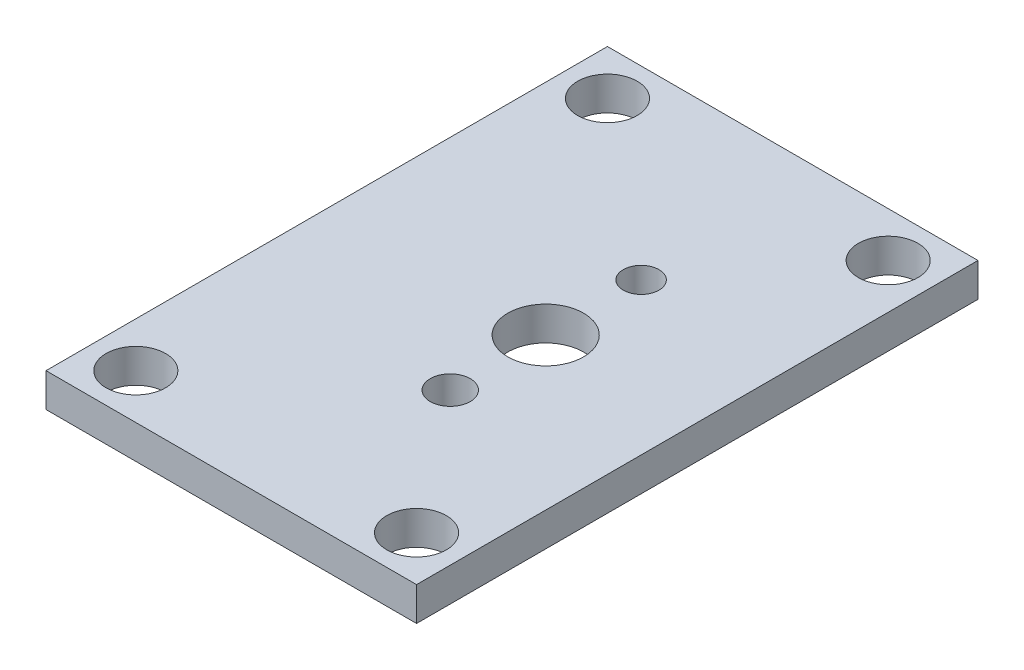
ISO-10303-21;
HEADER;
FILE_DESCRIPTION(('STEP AP214'),'2;1');
FILE_NAME('part.step','',(''),(''),'','','');
FILE_SCHEMA(('AUTOMOTIVE_DESIGN { 1 0 10303 214 1 1 1 1 }'));
ENDSEC;
DATA;
#1=APPLICATION_CONTEXT('core data for automotive mechanical design processes');
#2=APPLICATION_PROTOCOL_DEFINITION('international standard','automotive_design',2000,#1);
#3=PRODUCT_CONTEXT('',#1,'mechanical');
#4=PRODUCT('Part','Part','',(#3));
#5=PRODUCT_RELATED_PRODUCT_CATEGORY('part','',(#4));
#6=PRODUCT_DEFINITION_FORMATION('','',#4);
#7=PRODUCT_DEFINITION_CONTEXT('part definition',#1,'design');
#8=PRODUCT_DEFINITION('design','',#6,#7);
#9=PRODUCT_DEFINITION_SHAPE('','',#8);
#10=(LENGTH_UNIT() NAMED_UNIT(*) SI_UNIT(.MILLI.,.METRE.));
#11=(NAMED_UNIT(*) PLANE_ANGLE_UNIT() SI_UNIT($,.RADIAN.));
#12=(NAMED_UNIT(*) SI_UNIT($,.STERADIAN.) SOLID_ANGLE_UNIT());
#13=UNCERTAINTY_MEASURE_WITH_UNIT(LENGTH_MEASURE(1.E-05),#10,'distance_accuracy_value','');
#14=(GEOMETRIC_REPRESENTATION_CONTEXT(3) GLOBAL_UNCERTAINTY_ASSIGNED_CONTEXT((#13)) GLOBAL_UNIT_ASSIGNED_CONTEXT((#10,
#11,#12)) REPRESENTATION_CONTEXT('',''));
#15=CARTESIAN_POINT('',(0.,0.,0.));
#16=DIRECTION('',(0.,0.,1.));
#17=DIRECTION('',(1.,0.,0.));
#18=AXIS2_PLACEMENT_3D('',#15,#16,#17);
#19=CARTESIAN_POINT('',(0.,0.,0.));
#20=DIRECTION('',(0.,1.,0.));
#21=DIRECTION('',(0.,0.,1.));
#22=AXIS2_PLACEMENT_3D('',#19,#20,#21);
#23=PLANE('',#22);
#24=CARTESIAN_POINT('',(1.27695167286245,0.,-19.8847583643123));
#25=DIRECTION('',(0.,1.,0.));
#26=DIRECTION('',(0.,0.,1.));
#27=AXIS2_PLACEMENT_3D('',#24,#25,#26);
#28=CIRCLE('',#27,1.58978016760219);
#29=CARTESIAN_POINT('',(1.27695167286245,0.,-18.2949781967101));
#30=VERTEX_POINT('',#29);
#31=EDGE_CURVE('E129',#30,#30,#28,.T.);
#32=ORIENTED_EDGE('',*,*,#31,.T.);
#33=EDGE_LOOP('',(#32));
#34=FACE_BOUND('',#33,.T.);
#35=CARTESIAN_POINT('',(1.27695167286245,0.,-2.88475836431227));
#36=DIRECTION('',(0.,1.,0.));
#37=DIRECTION('',(0.,0.,1.));
#38=AXIS2_PLACEMENT_3D('',#35,#36,#37);
#39=CIRCLE('',#38,1.77742826201975);
#40=CARTESIAN_POINT('',(1.27695167286245,0.,-1.10733010229252));
#41=VERTEX_POINT('',#40);
#42=EDGE_CURVE('E127',#41,#41,#39,.T.);
#43=ORIENTED_EDGE('',*,*,#42,.T.);
#44=EDGE_LOOP('',(#43));
#45=FACE_BOUND('',#44,.T.);
#46=CARTESIAN_POINT('',(10.7769516728624,0.,-32.3847583643123));
#47=DIRECTION('',(0.,1.,0.));
#48=DIRECTION('',(0.,0.,1.));
#49=AXIS2_PLACEMENT_3D('',#46,#47,#48);
#50=CIRCLE('',#49,2.65);
#51=CARTESIAN_POINT('',(10.7769516728624,0.,-29.7347583643123));
#52=VERTEX_POINT('',#51);
#53=EDGE_CURVE('E147',#52,#52,#50,.F.);
#54=ORIENTED_EDGE('',*,*,#53,.F.);
#55=EDGE_LOOP('',(#54));
#56=FACE_BOUND('',#55,.T.);
#57=CARTESIAN_POINT('',(10.7769516728625,0.,9.61524163568773));
#58=DIRECTION('',(0.,1.,0.));
#59=DIRECTION('',(0.,0.,1.));
#60=AXIS2_PLACEMENT_3D('',#57,#58,#59);
#61=CIRCLE('',#60,2.65);
#62=CARTESIAN_POINT('',(10.7769516728625,0.,12.2652416356877));
#63=VERTEX_POINT('',#62);
#64=EDGE_CURVE('E141',#63,#63,#61,.F.);
#65=ORIENTED_EDGE('',*,*,#64,.F.);
#66=EDGE_LOOP('',(#65));
#67=FACE_BOUND('',#66,.T.);
#68=CARTESIAN_POINT('',(1.27695167286245,0.,-11.3847583643123));
#69=DIRECTION('',(0.,1.,0.));
#70=DIRECTION('',(0.,0.,1.));
#71=AXIS2_PLACEMENT_3D('',#68,#69,#70);
#72=CIRCLE('',#71,3.375);
#73=CARTESIAN_POINT('',(1.27695167286245,0.,-8.00975836431227));
#74=VERTEX_POINT('',#73);
#75=EDGE_CURVE('E115',#74,#74,#72,.T.);
#76=ORIENTED_EDGE('',*,*,#75,.T.);
#77=EDGE_LOOP('',(#76));
#78=FACE_BOUND('',#77,.T.);
#79=DIRECTION('',(1.,0.,0.));
#80=VECTOR('',#79,1.);
#81=CARTESIAN_POINT('',(-10.2230483271375,0.,13.6152416356877));
#82=LINE('',#81,#80);
#83=CARTESIAN_POINT('',(-18.2230483271375,0.,13.6152416356877));
#84=VERTEX_POINT('',#83);
#85=CARTESIAN_POINT('',(14.7769516728625,0.,13.6152416356877));
#86=VERTEX_POINT('',#85);
#87=EDGE_CURVE('E70',#84,#86,#82,.T.);
#88=ORIENTED_EDGE('',*,*,#87,.F.);
#89=DIRECTION('',(0.,0.,1.));
#90=VECTOR('',#89,1.);
#91=CARTESIAN_POINT('',(-18.2230483271375,0.,-36.3847583643123));
#92=LINE('',#91,#90);
#93=CARTESIAN_POINT('',(-18.2230483271375,0.,-36.3847583643123));
#94=VERTEX_POINT('',#93);
#95=EDGE_CURVE('E99',#94,#84,#92,.T.);
#96=ORIENTED_EDGE('',*,*,#95,.F.);
#97=DIRECTION('',(-1.,0.,0.));
#98=VECTOR('',#97,1.);
#99=CARTESIAN_POINT('',(-10.2230483271376,0.,-36.3847583643123));
#100=LINE('',#99,#98);
#101=CARTESIAN_POINT('',(14.7769516728625,0.,-36.3847583643123));
#102=VERTEX_POINT('',#101);
#103=EDGE_CURVE('E88',#102,#94,#100,.T.);
#104=ORIENTED_EDGE('',*,*,#103,.F.);
#105=DIRECTION('',(0.,0.,-1.));
#106=VECTOR('',#105,1.);
#107=CARTESIAN_POINT('',(14.7769516728625,0.,-36.3847583643123));
#108=LINE('',#107,#106);
#109=EDGE_CURVE('E96',#86,#102,#108,.T.);
#110=ORIENTED_EDGE('',*,*,#109,.F.);
#111=EDGE_LOOP('',(#88,#96,#104,#110));
#112=FACE_BOUND('',#111,.T.);
#113=CARTESIAN_POINT('',(-14.2230483271375,0.,-32.3847583643123));
#114=DIRECTION('',(0.,1.,0.));
#115=DIRECTION('',(0.,0.,1.));
#116=AXIS2_PLACEMENT_3D('',#113,#114,#115);
#117=CIRCLE('',#116,2.65);
#118=CARTESIAN_POINT('',(-14.2230483271375,0.,-29.7347583643123));
#119=VERTEX_POINT('',#118);
#120=EDGE_CURVE('E44',#119,#119,#117,.F.);
#121=ORIENTED_EDGE('',*,*,#120,.F.);
#122=EDGE_LOOP('',(#121));
#123=FACE_BOUND('',#122,.T.);
#124=CARTESIAN_POINT('',(-14.2230483271375,0.,9.61524163568773));
#125=DIRECTION('',(0.,1.,0.));
#126=DIRECTION('',(0.,0.,1.));
#127=AXIS2_PLACEMENT_3D('',#124,#125,#126);
#128=CIRCLE('',#127,2.65);
#129=CARTESIAN_POINT('',(-14.2230483271375,0.,12.2652416356877));
#130=VERTEX_POINT('',#129);
#131=EDGE_CURVE('E333',#130,#130,#128,.F.);
#132=ORIENTED_EDGE('',*,*,#131,.F.);
#133=EDGE_LOOP('',(#132));
#134=FACE_BOUND('',#133,.T.);
#135=ADVANCED_FACE('F40',(#34,#45,#56,#67,#78,#112,#123,#134),#23,.F.);
#136=CARTESIAN_POINT('',(0.,3.,0.));
#137=DIRECTION('',(0.,1.,0.));
#138=DIRECTION('',(0.,0.,1.));
#139=AXIS2_PLACEMENT_3D('',#136,#137,#138);
#140=PLANE('',#139);
#141=DIRECTION('',(0.,0.,-1.));
#142=VECTOR('',#141,1.);
#143=CARTESIAN_POINT('',(14.7769516728625,3.,-36.3847583643123));
#144=LINE('',#143,#142);
#145=CARTESIAN_POINT('',(14.7769516728625,3.,13.6152416356877));
#146=VERTEX_POINT('',#145);
#147=CARTESIAN_POINT('',(14.7769516728625,3.,-36.3847583643123));
#148=VERTEX_POINT('',#147);
#149=EDGE_CURVE('E59',#146,#148,#144,.T.);
#150=ORIENTED_EDGE('',*,*,#149,.T.);
#151=DIRECTION('',(-1.,0.,0.));
#152=VECTOR('',#151,1.);
#153=CARTESIAN_POINT('',(-10.2230483271376,3.,-36.3847583643123));
#154=LINE('',#153,#152);
#155=CARTESIAN_POINT('',(-18.2230483271376,3.,-36.3847583643123));
#156=VERTEX_POINT('',#155);
#157=EDGE_CURVE('E75',#148,#156,#154,.T.);
#158=ORIENTED_EDGE('',*,*,#157,.T.);
#159=DIRECTION('',(0.,0.,-1.));
#160=VECTOR('',#159,1.);
#161=CARTESIAN_POINT('',(-18.2230483271376,3.,-36.3847583643123));
#162=LINE('',#161,#160);
#163=CARTESIAN_POINT('',(-18.2230483271375,3.,13.6152416356877));
#164=VERTEX_POINT('',#163);
#165=EDGE_CURVE('E104',#164,#156,#162,.T.);
#166=ORIENTED_EDGE('',*,*,#165,.F.);
#167=DIRECTION('',(1.,0.,0.));
#168=VECTOR('',#167,1.);
#169=CARTESIAN_POINT('',(-10.2230483271375,3.,13.6152416356877));
#170=LINE('',#169,#168);
#171=EDGE_CURVE('E95',#164,#146,#170,.T.);
#172=ORIENTED_EDGE('',*,*,#171,.T.);
#173=EDGE_LOOP('',(#150,#158,#166,#172));
#174=FACE_BOUND('',#173,.T.);
#175=CARTESIAN_POINT('',(10.7769516728624,3.,-32.3847583643123));
#176=DIRECTION('',(0.,-1.,0.));
#177=DIRECTION('',(0.,0.,1.));
#178=AXIS2_PLACEMENT_3D('',#175,#176,#177);
#179=CIRCLE('',#178,2.65);
#180=CARTESIAN_POINT('',(10.7769516728624,3.,-29.7347583643123));
#181=VERTEX_POINT('',#180);
#182=EDGE_CURVE('E136',#181,#181,#179,.T.);
#183=ORIENTED_EDGE('',*,*,#182,.T.);
#184=EDGE_LOOP('',(#183));
#185=FACE_BOUND('',#184,.T.);
#186=CARTESIAN_POINT('',(10.7769516728625,3.,9.61524163568773));
#187=DIRECTION('',(0.,-1.,0.));
#188=DIRECTION('',(0.,0.,1.));
#189=AXIS2_PLACEMENT_3D('',#186,#187,#188);
#190=CIRCLE('',#189,2.65);
#191=CARTESIAN_POINT('',(10.7769516728625,3.,12.2652416356877));
#192=VERTEX_POINT('',#191);
#193=EDGE_CURVE('E132',#192,#192,#190,.T.);
#194=ORIENTED_EDGE('',*,*,#193,.T.);
#195=EDGE_LOOP('',(#194));
#196=FACE_BOUND('',#195,.T.);
#197=CARTESIAN_POINT('',(-14.2230483271375,3.,-32.3847583643123));
#198=DIRECTION('',(0.,1.,0.));
#199=DIRECTION('',(0.,0.,1.));
#200=AXIS2_PLACEMENT_3D('',#197,#198,#199);
#201=CIRCLE('',#200,2.65);
#202=CARTESIAN_POINT('',(-14.2230483271375,3.,-29.7347583643123));
#203=VERTEX_POINT('',#202);
#204=EDGE_CURVE('E106',#203,#203,#201,.T.);
#205=ORIENTED_EDGE('',*,*,#204,.F.);
#206=EDGE_LOOP('',(#205));
#207=FACE_BOUND('',#206,.T.);
#208=CARTESIAN_POINT('',(-14.2230483271375,3.,9.61524163568773));
#209=DIRECTION('',(0.,1.,0.));
#210=DIRECTION('',(0.,0.,1.));
#211=AXIS2_PLACEMENT_3D('',#208,#209,#210);
#212=CIRCLE('',#211,2.65);
#213=CARTESIAN_POINT('',(-14.2230483271375,3.,12.2652416356877));
#214=VERTEX_POINT('',#213);
#215=EDGE_CURVE('E110',#214,#214,#212,.T.);
#216=ORIENTED_EDGE('',*,*,#215,.F.);
#217=EDGE_LOOP('',(#216));
#218=FACE_BOUND('',#217,.T.);
#219=CARTESIAN_POINT('',(1.27695167286245,3.,-19.8847583643123));
#220=DIRECTION('',(0.,1.,0.));
#221=DIRECTION('',(0.,0.,1.));
#222=AXIS2_PLACEMENT_3D('',#219,#220,#221);
#223=CIRCLE('',#222,1.58978016760219);
#224=CARTESIAN_POINT('',(1.27695167286245,3.,-18.2949781967101));
#225=VERTEX_POINT('',#224);
#226=EDGE_CURVE('E130',#225,#225,#223,.T.);
#227=ORIENTED_EDGE('',*,*,#226,.F.);
#228=EDGE_LOOP('',(#227));
#229=FACE_BOUND('',#228,.T.);
#230=CARTESIAN_POINT('',(1.27695167286245,3.,-2.88475836431227));
#231=DIRECTION('',(0.,1.,0.));
#232=DIRECTION('',(0.,0.,1.));
#233=AXIS2_PLACEMENT_3D('',#230,#231,#232);
#234=CIRCLE('',#233,1.77742826201975);
#235=CARTESIAN_POINT('',(1.27695167286245,3.,-1.10733010229252));
#236=VERTEX_POINT('',#235);
#237=EDGE_CURVE('E166',#236,#236,#234,.T.);
#238=ORIENTED_EDGE('',*,*,#237,.F.);
#239=EDGE_LOOP('',(#238));
#240=FACE_BOUND('',#239,.T.);
#241=CARTESIAN_POINT('',(1.27695167286245,3.,-11.3847583643123));
#242=DIRECTION('',(0.,1.,0.));
#243=DIRECTION('',(0.,0.,1.));
#244=AXIS2_PLACEMENT_3D('',#241,#242,#243);
#245=CIRCLE('',#244,3.375);
#246=CARTESIAN_POINT('',(1.27695167286245,3.,-8.00975836431227));
#247=VERTEX_POINT('',#246);
#248=EDGE_CURVE('E116',#247,#247,#245,.T.);
#249=ORIENTED_EDGE('',*,*,#248,.F.);
#250=EDGE_LOOP('',(#249));
#251=FACE_BOUND('',#250,.T.);
#252=ADVANCED_FACE('F156',(#174,#185,#196,#207,#218,#229,#240,#251),#140,.T.);
#253=CARTESIAN_POINT('',(-10.2230483271375,3.,13.6152416356877));
#254=DIRECTION('',(0.,0.,-1.));
#255=DIRECTION('',(-1.,0.,0.));
#256=AXIS2_PLACEMENT_3D('',#253,#254,#255);
#257=PLANE('',#256);
#258=DIRECTION('',(0.,1.,0.));
#259=VECTOR('',#258,1.);
#260=CARTESIAN_POINT('',(-18.2230483271375,3.,13.6152416356877));
#261=LINE('',#260,#259);
#262=EDGE_CURVE('E105',#84,#164,#261,.T.);
#263=ORIENTED_EDGE('',*,*,#262,.F.);
#264=ORIENTED_EDGE('',*,*,#87,.T.);
#265=DIRECTION('',(0.,-1.,0.));
#266=VECTOR('',#265,1.);
#267=CARTESIAN_POINT('',(14.7769516728625,3.,13.6152416356877));
#268=LINE('',#267,#266);
#269=EDGE_CURVE('E11',#146,#86,#268,.T.);
#270=ORIENTED_EDGE('',*,*,#269,.F.);
#271=ORIENTED_EDGE('',*,*,#171,.F.);
#272=EDGE_LOOP('',(#263,#264,#270,#271));
#273=FACE_BOUND('',#272,.T.);
#274=ADVANCED_FACE('F42',(#273),#257,.F.);
#275=CARTESIAN_POINT('',(14.7769516728625,3.,-36.3847583643123));
#276=DIRECTION('',(-1.,0.,0.));
#277=DIRECTION('',(0.,0.,1.));
#278=AXIS2_PLACEMENT_3D('',#275,#276,#277);
#279=PLANE('',#278);
#280=DIRECTION('',(0.,-1.,0.));
#281=VECTOR('',#280,1.);
#282=CARTESIAN_POINT('',(14.7769516728625,3.,-36.3847583643123));
#283=LINE('',#282,#281);
#284=EDGE_CURVE('E50',#148,#102,#283,.T.);
#285=ORIENTED_EDGE('',*,*,#284,.F.);
#286=ORIENTED_EDGE('',*,*,#149,.F.);
#287=ORIENTED_EDGE('',*,*,#269,.T.);
#288=ORIENTED_EDGE('',*,*,#109,.T.);
#289=EDGE_LOOP('',(#285,#286,#287,#288));
#290=FACE_BOUND('',#289,.T.);
#291=ADVANCED_FACE('F183',(#290),#279,.F.);
#292=CARTESIAN_POINT('',(-10.2230483271376,3.,-36.3847583643123));
#293=DIRECTION('',(0.,0.,1.));
#294=DIRECTION('',(1.,0.,0.));
#295=AXIS2_PLACEMENT_3D('',#292,#293,#294);
#296=PLANE('',#295);
#297=ORIENTED_EDGE('',*,*,#103,.T.);
#298=DIRECTION('',(0.,-1.,0.));
#299=VECTOR('',#298,1.);
#300=CARTESIAN_POINT('',(-18.2230483271376,3.,-36.3847583643123));
#301=LINE('',#300,#299);
#302=EDGE_CURVE('E92',#156,#94,#301,.T.);
#303=ORIENTED_EDGE('',*,*,#302,.F.);
#304=ORIENTED_EDGE('',*,*,#157,.F.);
#305=ORIENTED_EDGE('',*,*,#284,.T.);
#306=EDGE_LOOP('',(#297,#303,#304,#305));
#307=FACE_BOUND('',#306,.T.);
#308=ADVANCED_FACE('F90',(#307),#296,.F.);
#309=CARTESIAN_POINT('',(1.27695167286245,3.,-11.3847583643123));
#310=DIRECTION('',(0.,-1.,0.));
#311=DIRECTION('',(0.,0.,-1.));
#312=AXIS2_PLACEMENT_3D('',#309,#310,#311);
#313=CYLINDRICAL_SURFACE('',#312,3.375);
#314=ORIENTED_EDGE('',*,*,#248,.T.);
#315=EDGE_LOOP('',(#314));
#316=FACE_BOUND('',#315,.T.);
#317=ORIENTED_EDGE('',*,*,#75,.F.);
#318=EDGE_LOOP('',(#317));
#319=FACE_BOUND('',#318,.T.);
#320=ADVANCED_FACE('F169',(#316,#319),#313,.F.);
#321=CARTESIAN_POINT('',(-18.2230483271375,0.,0.));
#322=DIRECTION('',(-1.,0.,0.));
#323=DIRECTION('',(0.,0.,1.));
#324=AXIS2_PLACEMENT_3D('',#321,#322,#323);
#325=PLANE('',#324);
#326=ORIENTED_EDGE('',*,*,#95,.T.);
#327=ORIENTED_EDGE('',*,*,#262,.T.);
#328=ORIENTED_EDGE('',*,*,#165,.T.);
#329=ORIENTED_EDGE('',*,*,#302,.T.);
#330=EDGE_LOOP('',(#326,#327,#328,#329));
#331=FACE_BOUND('',#330,.T.);
#332=ADVANCED_FACE('F103',(#331),#325,.T.);
#333=CARTESIAN_POINT('',(-14.2230483271375,-0.3,9.61524163568773));
#334=DIRECTION('',(0.,1.,0.));
#335=DIRECTION('',(0.,0.,1.));
#336=AXIS2_PLACEMENT_3D('',#333,#334,#335);
#337=CYLINDRICAL_SURFACE('',#336,2.65);
#338=ORIENTED_EDGE('',*,*,#131,.T.);
#339=EDGE_LOOP('',(#338));
#340=FACE_BOUND('',#339,.T.);
#341=ORIENTED_EDGE('',*,*,#215,.T.);
#342=EDGE_LOOP('',(#341));
#343=FACE_BOUND('',#342,.T.);
#344=ADVANCED_FACE('F154',(#340,#343),#337,.F.);
#345=CARTESIAN_POINT('',(-14.2230483271375,-0.3,-32.3847583643123));
#346=DIRECTION('',(0.,1.,0.));
#347=DIRECTION('',(0.,0.,1.));
#348=AXIS2_PLACEMENT_3D('',#345,#346,#347);
#349=CYLINDRICAL_SURFACE('',#348,2.65);
#350=ORIENTED_EDGE('',*,*,#120,.T.);
#351=EDGE_LOOP('',(#350));
#352=FACE_BOUND('',#351,.T.);
#353=ORIENTED_EDGE('',*,*,#204,.T.);
#354=EDGE_LOOP('',(#353));
#355=FACE_BOUND('',#354,.T.);
#356=ADVANCED_FACE('F195',(#352,#355),#349,.F.);
#357=CARTESIAN_POINT('',(10.7769516728625,-0.3,9.61524163568773));
#358=DIRECTION('',(0.,1.,0.));
#359=DIRECTION('',(0.,0.,1.));
#360=AXIS2_PLACEMENT_3D('',#357,#358,#359);
#361=CYLINDRICAL_SURFACE('',#360,2.65);
#362=ORIENTED_EDGE('',*,*,#193,.F.);
#363=EDGE_LOOP('',(#362));
#364=FACE_BOUND('',#363,.T.);
#365=ORIENTED_EDGE('',*,*,#64,.T.);
#366=EDGE_LOOP('',(#365));
#367=FACE_BOUND('',#366,.T.);
#368=ADVANCED_FACE('F197',(#364,#367),#361,.F.);
#369=CARTESIAN_POINT('',(10.7769516728624,-0.3,-32.3847583643123));
#370=DIRECTION('',(0.,1.,0.));
#371=DIRECTION('',(0.,0.,1.));
#372=AXIS2_PLACEMENT_3D('',#369,#370,#371);
#373=CYLINDRICAL_SURFACE('',#372,2.65);
#374=ORIENTED_EDGE('',*,*,#182,.F.);
#375=EDGE_LOOP('',(#374));
#376=FACE_BOUND('',#375,.T.);
#377=ORIENTED_EDGE('',*,*,#53,.T.);
#378=EDGE_LOOP('',(#377));
#379=FACE_BOUND('',#378,.T.);
#380=ADVANCED_FACE('F204',(#376,#379),#373,.F.);
#381=CARTESIAN_POINT('',(1.27695167286245,-7.,-2.88475836431227));
#382=DIRECTION('',(0.,1.,0.));
#383=DIRECTION('',(0.,0.,1.));
#384=AXIS2_PLACEMENT_3D('',#381,#382,#383);
#385=CYLINDRICAL_SURFACE('',#384,1.77742826201975);
#386=ORIENTED_EDGE('',*,*,#237,.T.);
#387=EDGE_LOOP('',(#386));
#388=FACE_BOUND('',#387,.T.);
#389=ORIENTED_EDGE('',*,*,#42,.F.);
#390=EDGE_LOOP('',(#389));
#391=FACE_BOUND('',#390,.T.);
#392=ADVANCED_FACE('F243',(#388,#391),#385,.F.);
#393=CARTESIAN_POINT('',(1.27695167286245,-7.,-19.8847583643123));
#394=DIRECTION('',(0.,1.,0.));
#395=DIRECTION('',(0.,0.,1.));
#396=AXIS2_PLACEMENT_3D('',#393,#394,#395);
#397=CYLINDRICAL_SURFACE('',#396,1.58978016760219);
#398=ORIENTED_EDGE('',*,*,#226,.T.);
#399=EDGE_LOOP('',(#398));
#400=FACE_BOUND('',#399,.T.);
#401=ORIENTED_EDGE('',*,*,#31,.F.);
#402=EDGE_LOOP('',(#401));
#403=FACE_BOUND('',#402,.T.);
#404=ADVANCED_FACE('F239',(#400,#403),#397,.F.);
#405=CLOSED_SHELL('',(#135,#252,#274,#291,#308,#320,#332,#344,#356,#368,#380,#392,#404));
#406=MANIFOLD_SOLID_BREP('B2',#405);
#407=ADVANCED_BREP_SHAPE_REPRESENTATION('',(#18,#406),#14);
#408=SHAPE_DEFINITION_REPRESENTATION(#9,#407);
ENDSEC;
END-ISO-10303-21;
